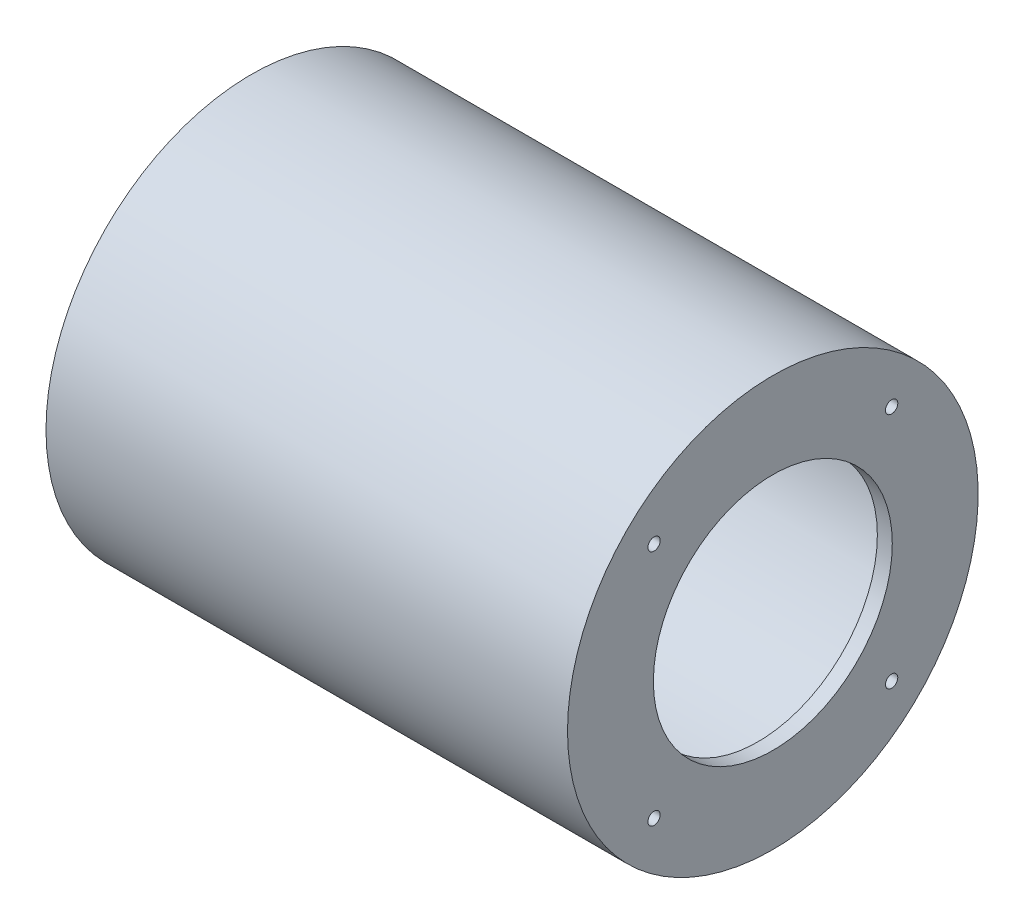
ISO-10303-21;
HEADER;
FILE_DESCRIPTION(('STEP AP214'),'2;1');
FILE_NAME('part.step','',(''),(''),'','','');
FILE_SCHEMA(('AUTOMOTIVE_DESIGN { 1 0 10303 214 1 1 1 1 }'));
ENDSEC;
DATA;
#1=APPLICATION_CONTEXT('core data for automotive mechanical design processes');
#2=APPLICATION_PROTOCOL_DEFINITION('international standard','automotive_design',2000,#1);
#3=PRODUCT_CONTEXT('',#1,'mechanical');
#4=PRODUCT('Part','Part','',(#3));
#5=PRODUCT_RELATED_PRODUCT_CATEGORY('part','',(#4));
#6=PRODUCT_DEFINITION_FORMATION('','',#4);
#7=PRODUCT_DEFINITION_CONTEXT('part definition',#1,'design');
#8=PRODUCT_DEFINITION('design','',#6,#7);
#9=PRODUCT_DEFINITION_SHAPE('','',#8);
#10=(LENGTH_UNIT() NAMED_UNIT(*) SI_UNIT(.MILLI.,.METRE.));
#11=(NAMED_UNIT(*) PLANE_ANGLE_UNIT() SI_UNIT($,.RADIAN.));
#12=(NAMED_UNIT(*) SI_UNIT($,.STERADIAN.) SOLID_ANGLE_UNIT());
#13=UNCERTAINTY_MEASURE_WITH_UNIT(LENGTH_MEASURE(1.E-05),#10,'distance_accuracy_value','');
#14=(GEOMETRIC_REPRESENTATION_CONTEXT(3) GLOBAL_UNCERTAINTY_ASSIGNED_CONTEXT((#13)) GLOBAL_UNIT_ASSIGNED_CONTEXT((#10,
#11,#12)) REPRESENTATION_CONTEXT('',''));
#15=CARTESIAN_POINT('',(0.,0.,0.));
#16=DIRECTION('',(0.,0.,1.));
#17=DIRECTION('',(1.,0.,0.));
#18=AXIS2_PLACEMENT_3D('',#15,#16,#17);
#19=CARTESIAN_POINT('',(-126.,55.,0.));
#20=DIRECTION('',(1.,0.,0.));
#21=DIRECTION('',(0.,0.,-1.));
#22=AXIS2_PLACEMENT_3D('',#19,#20,#21);
#23=PLANE('',#22);
#24=CARTESIAN_POINT('',(-126.,52.,0.));
#25=DIRECTION('',(1.,0.,0.));
#26=DIRECTION('',(0.,0.,-1.));
#27=AXIS2_PLACEMENT_3D('',#24,#25,#26);
#28=CIRCLE('',#27,1.25);
#29=CARTESIAN_POINT('',(-126.,52.,-1.25));
#30=VERTEX_POINT('',#29);
#31=EDGE_CURVE('E99',#30,#30,#28,.T.);
#32=ORIENTED_EDGE('',*,*,#31,.T.);
#33=EDGE_LOOP('',(#32));
#34=FACE_BOUND('',#33,.T.);
#35=CARTESIAN_POINT('',(-126.,0.,52.));
#36=DIRECTION('',(1.,0.,0.));
#37=DIRECTION('',(0.,0.,-1.));
#38=AXIS2_PLACEMENT_3D('',#35,#36,#37);
#39=CIRCLE('',#38,1.25);
#40=CARTESIAN_POINT('',(-126.,0.,50.75));
#41=VERTEX_POINT('',#40);
#42=EDGE_CURVE('E93',#41,#41,#39,.T.);
#43=ORIENTED_EDGE('',*,*,#42,.T.);
#44=EDGE_LOOP('',(#43));
#45=FACE_BOUND('',#44,.T.);
#46=CARTESIAN_POINT('',(-126.,-52.,0.));
#47=DIRECTION('',(1.,0.,0.));
#48=DIRECTION('',(0.,0.,-1.));
#49=AXIS2_PLACEMENT_3D('',#46,#47,#48);
#50=CIRCLE('',#49,1.25);
#51=CARTESIAN_POINT('',(-126.,-52.,-1.24999999999999));
#52=VERTEX_POINT('',#51);
#53=EDGE_CURVE('E87',#52,#52,#50,.T.);
#54=ORIENTED_EDGE('',*,*,#53,.T.);
#55=EDGE_LOOP('',(#54));
#56=FACE_BOUND('',#55,.T.);
#57=CARTESIAN_POINT('',(-126.,0.,-52.));
#58=DIRECTION('',(1.,0.,0.));
#59=DIRECTION('',(0.,0.,-1.));
#60=AXIS2_PLACEMENT_3D('',#57,#58,#59);
#61=CIRCLE('',#60,1.25);
#62=CARTESIAN_POINT('',(-126.,0.,-53.25));
#63=VERTEX_POINT('',#62);
#64=EDGE_CURVE('E81',#63,#63,#61,.T.);
#65=ORIENTED_EDGE('',*,*,#64,.T.);
#66=EDGE_LOOP('',(#65));
#67=FACE_BOUND('',#66,.T.);
#68=CARTESIAN_POINT('',(-126.,0.,0.));
#69=DIRECTION('',(-1.,0.,0.));
#70=DIRECTION('',(0.,0.,1.));
#71=AXIS2_PLACEMENT_3D('',#68,#69,#70);
#72=CIRCLE('',#71,49.);
#73=CARTESIAN_POINT('',(-126.,0.,49.));
#74=VERTEX_POINT('',#73);
#75=EDGE_CURVE('E10',#74,#74,#72,.T.);
#76=ORIENTED_EDGE('',*,*,#75,.F.);
#77=EDGE_LOOP('',(#76));
#78=FACE_BOUND('',#77,.T.);
#79=CARTESIAN_POINT('',(-126.,0.,0.));
#80=DIRECTION('',(-1.,0.,0.));
#81=DIRECTION('',(0.,0.,1.));
#82=AXIS2_PLACEMENT_3D('',#79,#80,#81);
#83=CIRCLE('',#82,55.);
#84=CARTESIAN_POINT('',(-126.,0.,55.));
#85=VERTEX_POINT('',#84);
#86=EDGE_CURVE('E53',#85,#85,#83,.T.);
#87=ORIENTED_EDGE('',*,*,#86,.T.);
#88=EDGE_LOOP('',(#87));
#89=FACE_BOUND('',#88,.T.);
#90=ADVANCED_FACE('F31',(#34,#45,#56,#67,#78,#89),#23,.F.);
#91=CARTESIAN_POINT('',(-110.,0.,0.));
#92=DIRECTION('',(-1.,0.,0.));
#93=DIRECTION('',(0.,0.,1.));
#94=AXIS2_PLACEMENT_3D('',#91,#92,#93);
#95=CYLINDRICAL_SURFACE('',#94,49.);
#96=CARTESIAN_POINT('',(9.7,0.,0.));
#97=DIRECTION('',(-1.,0.,0.));
#98=DIRECTION('',(0.,0.,1.));
#99=AXIS2_PLACEMENT_3D('',#96,#97,#98);
#100=CIRCLE('',#99,49.);
#101=CARTESIAN_POINT('',(9.7,0.,49.));
#102=VERTEX_POINT('',#101);
#103=EDGE_CURVE('E37',#102,#102,#100,.T.);
#104=ORIENTED_EDGE('',*,*,#103,.F.);
#105=EDGE_LOOP('',(#104));
#106=FACE_BOUND('',#105,.T.);
#107=ORIENTED_EDGE('',*,*,#75,.T.);
#108=EDGE_LOOP('',(#107));
#109=FACE_BOUND('',#108,.T.);
#110=ADVANCED_FACE('F117',(#106,#109),#95,.F.);
#111=CARTESIAN_POINT('',(9.7,49.,0.));
#112=DIRECTION('',(1.,0.,0.));
#113=DIRECTION('',(0.,0.,-1.));
#114=AXIS2_PLACEMENT_3D('',#111,#112,#113);
#115=PLANE('',#114);
#116=CARTESIAN_POINT('',(9.7,31.8198051533946,-31.8198051533946));
#117=DIRECTION('',(1.,0.,0.));
#118=DIRECTION('',(0.,0.,-1.));
#119=AXIS2_PLACEMENT_3D('',#116,#117,#118);
#120=CIRCLE('',#119,1.65);
#121=CARTESIAN_POINT('',(9.7,31.8198051533946,-33.4698051533946));
#122=VERTEX_POINT('',#121);
#123=EDGE_CURVE('E63',#122,#122,#120,.T.);
#124=ORIENTED_EDGE('',*,*,#123,.T.);
#125=EDGE_LOOP('',(#124));
#126=FACE_BOUND('',#125,.T.);
#127=CARTESIAN_POINT('',(9.7,-31.8198051533946,-31.8198051533946));
#128=DIRECTION('',(1.,0.,0.));
#129=DIRECTION('',(0.,0.,-1.));
#130=AXIS2_PLACEMENT_3D('',#127,#128,#129);
#131=CIRCLE('',#130,1.65);
#132=CARTESIAN_POINT('',(9.7,-31.8198051533946,-33.4698051533946));
#133=VERTEX_POINT('',#132);
#134=EDGE_CURVE('E70',#133,#133,#131,.T.);
#135=ORIENTED_EDGE('',*,*,#134,.T.);
#136=EDGE_LOOP('',(#135));
#137=FACE_BOUND('',#136,.T.);
#138=CARTESIAN_POINT('',(9.7,-31.8198051533946,31.8198051533946));
#139=DIRECTION('',(1.,0.,0.));
#140=DIRECTION('',(0.,0.,-1.));
#141=AXIS2_PLACEMENT_3D('',#138,#139,#140);
#142=CIRCLE('',#141,1.65);
#143=CARTESIAN_POINT('',(9.7,-31.8198051533946,30.1698051533946));
#144=VERTEX_POINT('',#143);
#145=EDGE_CURVE('E76',#144,#144,#142,.T.);
#146=ORIENTED_EDGE('',*,*,#145,.T.);
#147=EDGE_LOOP('',(#146));
#148=FACE_BOUND('',#147,.T.);
#149=CARTESIAN_POINT('',(9.7,31.8198051533946,31.8198051533946));
#150=DIRECTION('',(1.,0.,0.));
#151=DIRECTION('',(0.,0.,-1.));
#152=AXIS2_PLACEMENT_3D('',#149,#150,#151);
#153=CIRCLE('',#152,1.65);
#154=CARTESIAN_POINT('',(9.7,31.8198051533946,30.1698051533946));
#155=VERTEX_POINT('',#154);
#156=EDGE_CURVE('E57',#155,#155,#153,.T.);
#157=ORIENTED_EDGE('',*,*,#156,.T.);
#158=EDGE_LOOP('',(#157));
#159=FACE_BOUND('',#158,.T.);
#160=CARTESIAN_POINT('',(9.7,0.,0.));
#161=DIRECTION('',(-1.,0.,0.));
#162=DIRECTION('',(0.,0.,1.));
#163=AXIS2_PLACEMENT_3D('',#160,#161,#162);
#164=CIRCLE('',#163,32.);
#165=CARTESIAN_POINT('',(9.7,0.,32.));
#166=VERTEX_POINT('',#165);
#167=EDGE_CURVE('E41',#166,#166,#164,.T.);
#168=ORIENTED_EDGE('',*,*,#167,.F.);
#169=EDGE_LOOP('',(#168));
#170=FACE_BOUND('',#169,.T.);
#171=ORIENTED_EDGE('',*,*,#103,.T.);
#172=EDGE_LOOP('',(#171));
#173=FACE_BOUND('',#172,.T.);
#174=ADVANCED_FACE('F122',(#126,#137,#148,#159,#170,#173),#115,.F.);
#175=CARTESIAN_POINT('',(-110.,0.,0.));
#176=DIRECTION('',(-1.,0.,0.));
#177=DIRECTION('',(0.,0.,1.));
#178=AXIS2_PLACEMENT_3D('',#175,#176,#177);
#179=CYLINDRICAL_SURFACE('',#178,32.);
#180=CARTESIAN_POINT('',(13.7,0.,0.));
#181=DIRECTION('',(-1.,0.,0.));
#182=DIRECTION('',(0.,0.,1.));
#183=AXIS2_PLACEMENT_3D('',#180,#181,#182);
#184=CIRCLE('',#183,32.);
#185=CARTESIAN_POINT('',(13.7,0.,32.));
#186=VERTEX_POINT('',#185);
#187=EDGE_CURVE('E45',#186,#186,#184,.T.);
#188=ORIENTED_EDGE('',*,*,#187,.F.);
#189=EDGE_LOOP('',(#188));
#190=FACE_BOUND('',#189,.T.);
#191=ORIENTED_EDGE('',*,*,#167,.T.);
#192=EDGE_LOOP('',(#191));
#193=FACE_BOUND('',#192,.T.);
#194=ADVANCED_FACE('F145',(#190,#193),#179,.F.);
#195=CARTESIAN_POINT('',(13.7,32.,0.));
#196=DIRECTION('',(-1.,0.,0.));
#197=DIRECTION('',(0.,0.,1.));
#198=AXIS2_PLACEMENT_3D('',#195,#196,#197);
#199=PLANE('',#198);
#200=CARTESIAN_POINT('',(13.7,31.8198051533946,-31.8198051533946));
#201=DIRECTION('',(1.,0.,0.));
#202=DIRECTION('',(0.,0.,-1.));
#203=AXIS2_PLACEMENT_3D('',#200,#201,#202);
#204=CIRCLE('',#203,1.65);
#205=CARTESIAN_POINT('',(13.7,31.8198051533946,-33.4698051533946));
#206=VERTEX_POINT('',#205);
#207=EDGE_CURVE('E66',#206,#206,#204,.T.);
#208=ORIENTED_EDGE('',*,*,#207,.F.);
#209=EDGE_LOOP('',(#208));
#210=FACE_BOUND('',#209,.T.);
#211=CARTESIAN_POINT('',(13.7,-31.8198051533946,-31.8198051533946));
#212=DIRECTION('',(1.,0.,0.));
#213=DIRECTION('',(0.,0.,-1.));
#214=AXIS2_PLACEMENT_3D('',#211,#212,#213);
#215=CIRCLE('',#214,1.65);
#216=CARTESIAN_POINT('',(13.7,-31.8198051533946,-33.4698051533946));
#217=VERTEX_POINT('',#216);
#218=EDGE_CURVE('E73',#217,#217,#215,.T.);
#219=ORIENTED_EDGE('',*,*,#218,.F.);
#220=EDGE_LOOP('',(#219));
#221=FACE_BOUND('',#220,.T.);
#222=CARTESIAN_POINT('',(13.7,-31.8198051533946,31.8198051533946));
#223=DIRECTION('',(1.,0.,0.));
#224=DIRECTION('',(0.,0.,-1.));
#225=AXIS2_PLACEMENT_3D('',#222,#223,#224);
#226=CIRCLE('',#225,1.65);
#227=CARTESIAN_POINT('',(13.7,-31.8198051533946,30.1698051533946));
#228=VERTEX_POINT('',#227);
#229=EDGE_CURVE('E60',#228,#228,#226,.T.);
#230=ORIENTED_EDGE('',*,*,#229,.F.);
#231=EDGE_LOOP('',(#230));
#232=FACE_BOUND('',#231,.T.);
#233=CARTESIAN_POINT('',(13.7,31.8198051533946,31.8198051533946));
#234=DIRECTION('',(1.,0.,0.));
#235=DIRECTION('',(0.,0.,-1.));
#236=AXIS2_PLACEMENT_3D('',#233,#234,#235);
#237=CIRCLE('',#236,1.65);
#238=CARTESIAN_POINT('',(13.7,31.8198051533946,30.1698051533946));
#239=VERTEX_POINT('',#238);
#240=EDGE_CURVE('E56',#239,#239,#237,.T.);
#241=ORIENTED_EDGE('',*,*,#240,.F.);
#242=EDGE_LOOP('',(#241));
#243=FACE_BOUND('',#242,.T.);
#244=CARTESIAN_POINT('',(13.7,0.,0.));
#245=DIRECTION('',(-1.,0.,0.));
#246=DIRECTION('',(0.,0.,1.));
#247=AXIS2_PLACEMENT_3D('',#244,#245,#246);
#248=CIRCLE('',#247,55.);
#249=CARTESIAN_POINT('',(13.7,0.,55.));
#250=VERTEX_POINT('',#249);
#251=EDGE_CURVE('E50',#250,#250,#248,.T.);
#252=ORIENTED_EDGE('',*,*,#251,.F.);
#253=EDGE_LOOP('',(#252));
#254=FACE_BOUND('',#253,.T.);
#255=ORIENTED_EDGE('',*,*,#187,.T.);
#256=EDGE_LOOP('',(#255));
#257=FACE_BOUND('',#256,.T.);
#258=ADVANCED_FACE('F139',(#210,#221,#232,#243,#254,#257),#199,.F.);
#259=CARTESIAN_POINT('',(-110.,0.,0.));
#260=DIRECTION('',(-1.,0.,0.));
#261=DIRECTION('',(0.,0.,1.));
#262=AXIS2_PLACEMENT_3D('',#259,#260,#261);
#263=CYLINDRICAL_SURFACE('',#262,55.);
#264=ORIENTED_EDGE('',*,*,#86,.F.);
#265=EDGE_LOOP('',(#264));
#266=FACE_BOUND('',#265,.T.);
#267=ORIENTED_EDGE('',*,*,#251,.T.);
#268=EDGE_LOOP('',(#267));
#269=FACE_BOUND('',#268,.T.);
#270=ADVANCED_FACE('F135',(#266,#269),#263,.T.);
#271=CARTESIAN_POINT('',(13.7,31.8198051533946,31.8198051533946));
#272=DIRECTION('',(-1.,0.,0.));
#273=DIRECTION('',(0.,0.,1.));
#274=AXIS2_PLACEMENT_3D('',#271,#272,#273);
#275=CYLINDRICAL_SURFACE('',#274,1.65);
#276=ORIENTED_EDGE('',*,*,#240,.T.);
#277=EDGE_LOOP('',(#276));
#278=FACE_BOUND('',#277,.T.);
#279=ORIENTED_EDGE('',*,*,#156,.F.);
#280=EDGE_LOOP('',(#279));
#281=FACE_BOUND('',#280,.T.);
#282=ADVANCED_FACE('F138',(#278,#281),#275,.F.);
#283=CARTESIAN_POINT('',(13.7,-31.8198051533946,31.8198051533946));
#284=DIRECTION('',(-1.,0.,0.));
#285=DIRECTION('',(0.,0.,1.));
#286=AXIS2_PLACEMENT_3D('',#283,#284,#285);
#287=CYLINDRICAL_SURFACE('',#286,1.65);
#288=ORIENTED_EDGE('',*,*,#229,.T.);
#289=EDGE_LOOP('',(#288));
#290=FACE_BOUND('',#289,.T.);
#291=ORIENTED_EDGE('',*,*,#145,.F.);
#292=EDGE_LOOP('',(#291));
#293=FACE_BOUND('',#292,.T.);
#294=ADVANCED_FACE('F164',(#290,#293),#287,.F.);
#295=CARTESIAN_POINT('',(13.7,-31.8198051533946,-31.8198051533946));
#296=DIRECTION('',(-1.,0.,0.));
#297=DIRECTION('',(0.,0.,1.));
#298=AXIS2_PLACEMENT_3D('',#295,#296,#297);
#299=CYLINDRICAL_SURFACE('',#298,1.65);
#300=ORIENTED_EDGE('',*,*,#218,.T.);
#301=EDGE_LOOP('',(#300));
#302=FACE_BOUND('',#301,.T.);
#303=ORIENTED_EDGE('',*,*,#134,.F.);
#304=EDGE_LOOP('',(#303));
#305=FACE_BOUND('',#304,.T.);
#306=ADVANCED_FACE('F170',(#302,#305),#299,.F.);
#307=CARTESIAN_POINT('',(13.7,31.8198051533946,-31.8198051533946));
#308=DIRECTION('',(-1.,0.,0.));
#309=DIRECTION('',(0.,0.,1.));
#310=AXIS2_PLACEMENT_3D('',#307,#308,#309);
#311=CYLINDRICAL_SURFACE('',#310,1.65);
#312=ORIENTED_EDGE('',*,*,#207,.T.);
#313=EDGE_LOOP('',(#312));
#314=FACE_BOUND('',#313,.T.);
#315=ORIENTED_EDGE('',*,*,#123,.F.);
#316=EDGE_LOOP('',(#315));
#317=FACE_BOUND('',#316,.T.);
#318=ADVANCED_FACE('F166',(#314,#317),#311,.F.);
#319=CARTESIAN_POINT('',(-120.,0.,-52.));
#320=DIRECTION('',(-1.,0.,0.));
#321=DIRECTION('',(0.,0.,1.));
#322=AXIS2_PLACEMENT_3D('',#319,#320,#321);
#323=CYLINDRICAL_SURFACE('',#322,1.25);
#324=CARTESIAN_POINT('',(-120.,0.,-52.));
#325=DIRECTION('',(1.,0.,0.));
#326=DIRECTION('',(0.,0.,-1.));
#327=AXIS2_PLACEMENT_3D('',#324,#325,#326);
#328=CIRCLE('',#327,1.25);
#329=CARTESIAN_POINT('',(-120.,0.,-53.25));
#330=VERTEX_POINT('',#329);
#331=EDGE_CURVE('E84',#330,#330,#328,.T.);
#332=ORIENTED_EDGE('',*,*,#331,.T.);
#333=EDGE_LOOP('',(#332));
#334=FACE_BOUND('',#333,.T.);
#335=ORIENTED_EDGE('',*,*,#64,.F.);
#336=EDGE_LOOP('',(#335));
#337=FACE_BOUND('',#336,.T.);
#338=ADVANCED_FACE('F169',(#334,#337),#323,.F.);
#339=CARTESIAN_POINT('',(-120.,0.,-52.));
#340=DIRECTION('',(1.,0.,0.));
#341=DIRECTION('',(0.,0.,-1.));
#342=AXIS2_PLACEMENT_3D('',#339,#340,#341);
#343=PLANE('',#342);
#344=ORIENTED_EDGE('',*,*,#331,.F.);
#345=EDGE_LOOP('',(#344));
#346=FACE_BOUND('',#345,.T.);
#347=ADVANCED_FACE('F180',(#346),#343,.F.);
#348=CARTESIAN_POINT('',(-120.,-52.,0.));
#349=DIRECTION('',(-1.,0.,0.));
#350=DIRECTION('',(0.,0.,1.));
#351=AXIS2_PLACEMENT_3D('',#348,#349,#350);
#352=CYLINDRICAL_SURFACE('',#351,1.25);
#353=CARTESIAN_POINT('',(-120.,-52.,0.));
#354=DIRECTION('',(1.,0.,0.));
#355=DIRECTION('',(0.,0.,-1.));
#356=AXIS2_PLACEMENT_3D('',#353,#354,#355);
#357=CIRCLE('',#356,1.25);
#358=CARTESIAN_POINT('',(-120.,-52.,-1.24999999999999));
#359=VERTEX_POINT('',#358);
#360=EDGE_CURVE('E90',#359,#359,#357,.T.);
#361=ORIENTED_EDGE('',*,*,#360,.T.);
#362=EDGE_LOOP('',(#361));
#363=FACE_BOUND('',#362,.T.);
#364=ORIENTED_EDGE('',*,*,#53,.F.);
#365=EDGE_LOOP('',(#364));
#366=FACE_BOUND('',#365,.T.);
#367=ADVANCED_FACE('F184',(#363,#366),#352,.F.);
#368=CARTESIAN_POINT('',(-120.,-52.,0.));
#369=DIRECTION('',(1.,0.,0.));
#370=DIRECTION('',(0.,0.,-1.));
#371=AXIS2_PLACEMENT_3D('',#368,#369,#370);
#372=PLANE('',#371);
#373=ORIENTED_EDGE('',*,*,#360,.F.);
#374=EDGE_LOOP('',(#373));
#375=FACE_BOUND('',#374,.T.);
#376=ADVANCED_FACE('F188',(#375),#372,.F.);
#377=CARTESIAN_POINT('',(-120.,0.,52.));
#378=DIRECTION('',(-1.,0.,0.));
#379=DIRECTION('',(0.,0.,1.));
#380=AXIS2_PLACEMENT_3D('',#377,#378,#379);
#381=CYLINDRICAL_SURFACE('',#380,1.25);
#382=CARTESIAN_POINT('',(-120.,0.,52.));
#383=DIRECTION('',(1.,0.,0.));
#384=DIRECTION('',(0.,0.,-1.));
#385=AXIS2_PLACEMENT_3D('',#382,#383,#384);
#386=CIRCLE('',#385,1.25);
#387=CARTESIAN_POINT('',(-120.,0.,50.75));
#388=VERTEX_POINT('',#387);
#389=EDGE_CURVE('E96',#388,#388,#386,.T.);
#390=ORIENTED_EDGE('',*,*,#389,.T.);
#391=EDGE_LOOP('',(#390));
#392=FACE_BOUND('',#391,.T.);
#393=ORIENTED_EDGE('',*,*,#42,.F.);
#394=EDGE_LOOP('',(#393));
#395=FACE_BOUND('',#394,.T.);
#396=ADVANCED_FACE('F192',(#392,#395),#381,.F.);
#397=CARTESIAN_POINT('',(-120.,0.,52.));
#398=DIRECTION('',(1.,0.,0.));
#399=DIRECTION('',(0.,0.,-1.));
#400=AXIS2_PLACEMENT_3D('',#397,#398,#399);
#401=PLANE('',#400);
#402=ORIENTED_EDGE('',*,*,#389,.F.);
#403=EDGE_LOOP('',(#402));
#404=FACE_BOUND('',#403,.T.);
#405=ADVANCED_FACE('F114',(#404),#401,.F.);
#406=CARTESIAN_POINT('',(-120.,52.,0.));
#407=DIRECTION('',(-1.,0.,0.));
#408=DIRECTION('',(0.,0.,1.));
#409=AXIS2_PLACEMENT_3D('',#406,#407,#408);
#410=CYLINDRICAL_SURFACE('',#409,1.25);
#411=CARTESIAN_POINT('',(-120.,52.,0.));
#412=DIRECTION('',(1.,0.,0.));
#413=DIRECTION('',(0.,0.,-1.));
#414=AXIS2_PLACEMENT_3D('',#411,#412,#413);
#415=CIRCLE('',#414,1.25);
#416=CARTESIAN_POINT('',(-120.,52.,-1.25));
#417=VERTEX_POINT('',#416);
#418=EDGE_CURVE('E67',#417,#417,#415,.T.);
#419=ORIENTED_EDGE('',*,*,#418,.T.);
#420=EDGE_LOOP('',(#419));
#421=FACE_BOUND('',#420,.T.);
#422=ORIENTED_EDGE('',*,*,#31,.F.);
#423=EDGE_LOOP('',(#422));
#424=FACE_BOUND('',#423,.T.);
#425=ADVANCED_FACE('F105',(#421,#424),#410,.F.);
#426=CARTESIAN_POINT('',(-120.,52.,0.));
#427=DIRECTION('',(1.,0.,0.));
#428=DIRECTION('',(0.,0.,-1.));
#429=AXIS2_PLACEMENT_3D('',#426,#427,#428);
#430=PLANE('',#429);
#431=ORIENTED_EDGE('',*,*,#418,.F.);
#432=EDGE_LOOP('',(#431));
#433=FACE_BOUND('',#432,.T.);
#434=ADVANCED_FACE('F108',(#433),#430,.F.);
#435=CLOSED_SHELL('',(#90,#110,#174,#194,#258,#270,#282,#294,#306,#318,#338,#347,#367,#376,#396,
#405,#425,#434));
#436=MANIFOLD_SOLID_BREP('B2',#435);
#437=ADVANCED_BREP_SHAPE_REPRESENTATION('',(#18,#436),#14);
#438=SHAPE_DEFINITION_REPRESENTATION(#9,#437);
ENDSEC;
END-ISO-10303-21;
